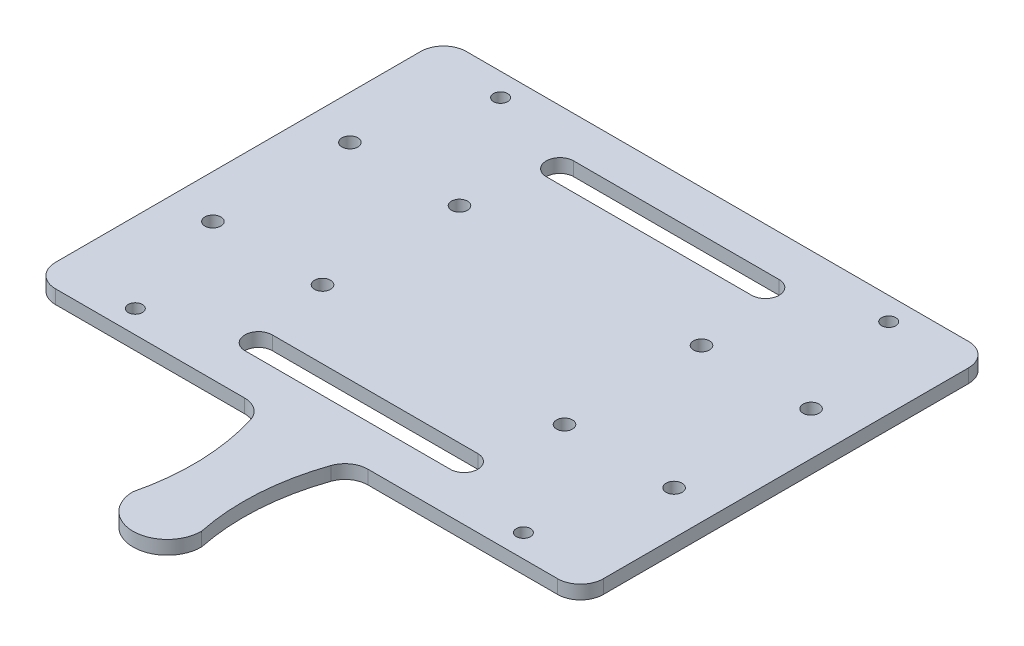
ISO-10303-21;
HEADER;
FILE_DESCRIPTION(('STEP AP214'),'2;1');
FILE_NAME('part.step','',(''),(''),'','','');
FILE_SCHEMA(('AUTOMOTIVE_DESIGN { 1 0 10303 214 1 1 1 1 }'));
ENDSEC;
DATA;
#1=APPLICATION_CONTEXT('core data for automotive mechanical design processes');
#2=APPLICATION_PROTOCOL_DEFINITION('international standard','automotive_design',2000,#1);
#3=PRODUCT_CONTEXT('',#1,'mechanical');
#4=PRODUCT('Part','Part','',(#3));
#5=PRODUCT_RELATED_PRODUCT_CATEGORY('part','',(#4));
#6=PRODUCT_DEFINITION_FORMATION('','',#4);
#7=PRODUCT_DEFINITION_CONTEXT('part definition',#1,'design');
#8=PRODUCT_DEFINITION('design','',#6,#7);
#9=PRODUCT_DEFINITION_SHAPE('','',#8);
#10=(LENGTH_UNIT() NAMED_UNIT(*) SI_UNIT(.MILLI.,.METRE.));
#11=(NAMED_UNIT(*) PLANE_ANGLE_UNIT() SI_UNIT($,.RADIAN.));
#12=(NAMED_UNIT(*) SI_UNIT($,.STERADIAN.) SOLID_ANGLE_UNIT());
#13=UNCERTAINTY_MEASURE_WITH_UNIT(LENGTH_MEASURE(1.E-05),#10,'distance_accuracy_value','');
#14=(GEOMETRIC_REPRESENTATION_CONTEXT(3) GLOBAL_UNCERTAINTY_ASSIGNED_CONTEXT((#13)) GLOBAL_UNIT_ASSIGNED_CONTEXT((#10,
#11,#12)) REPRESENTATION_CONTEXT('',''));
#15=CARTESIAN_POINT('',(0.,0.,0.));
#16=DIRECTION('',(0.,0.,1.));
#17=DIRECTION('',(1.,0.,0.));
#18=AXIS2_PLACEMENT_3D('',#15,#16,#17);
#19=CARTESIAN_POINT('',(60.,3.,45.));
#20=DIRECTION('',(0.,0.,-1.));
#21=DIRECTION('',(-1.,0.,0.));
#22=AXIS2_PLACEMENT_3D('',#19,#20,#21);
#23=PLANE('',#22);
#24=DIRECTION('',(1.,0.,0.));
#25=VECTOR('',#24,1.);
#26=CARTESIAN_POINT('',(60.,3.,45.));
#27=LINE('',#26,#25);
#28=CARTESIAN_POINT('',(13.420612610503,3.,45.));
#29=VERTEX_POINT('',#28);
#30=CARTESIAN_POINT('',(55.,3.,45.));
#31=VERTEX_POINT('',#30);
#32=EDGE_CURVE('E291',#29,#31,#27,.T.);
#33=ORIENTED_EDGE('',*,*,#32,.F.);
#34=DIRECTION('',(0.,1.,0.));
#35=VECTOR('',#34,1.);
#36=CARTESIAN_POINT('',(13.420612610503,3.,45.));
#37=LINE('',#36,#35);
#38=CARTESIAN_POINT('',(13.420612610503,0.,45.));
#39=VERTEX_POINT('',#38);
#40=EDGE_CURVE('E345',#29,#39,#37,.F.);
#41=ORIENTED_EDGE('',*,*,#40,.T.);
#42=DIRECTION('',(1.,0.,0.));
#43=VECTOR('',#42,1.);
#44=CARTESIAN_POINT('',(60.,0.,45.));
#45=LINE('',#44,#43);
#46=CARTESIAN_POINT('',(55.,0.,45.));
#47=VERTEX_POINT('',#46);
#48=EDGE_CURVE('E303',#39,#47,#45,.T.);
#49=ORIENTED_EDGE('',*,*,#48,.T.);
#50=DIRECTION('',(0.,-1.,0.));
#51=VECTOR('',#50,1.);
#52=CARTESIAN_POINT('',(55.,3.,45.));
#53=LINE('',#52,#51);
#54=EDGE_CURVE('E322',#47,#31,#53,.F.);
#55=ORIENTED_EDGE('',*,*,#54,.T.);
#56=EDGE_LOOP('',(#33,#41,#49,#55));
#57=FACE_BOUND('',#56,.T.);
#58=ADVANCED_FACE('F33',(#57),#23,.F.);
#59=CARTESIAN_POINT('',(60.,3.,-45.));
#60=DIRECTION('',(-1.,0.,0.));
#61=DIRECTION('',(0.,0.,1.));
#62=AXIS2_PLACEMENT_3D('',#59,#60,#61);
#63=PLANE('',#62);
#64=DIRECTION('',(0.,0.,-1.));
#65=VECTOR('',#64,1.);
#66=CARTESIAN_POINT('',(60.,3.,-45.));
#67=LINE('',#66,#65);
#68=CARTESIAN_POINT('',(60.,3.,40.));
#69=VERTEX_POINT('',#68);
#70=CARTESIAN_POINT('',(60.,3.,-40.));
#71=VERTEX_POINT('',#70);
#72=EDGE_CURVE('E281',#69,#71,#67,.T.);
#73=ORIENTED_EDGE('',*,*,#72,.F.);
#74=DIRECTION('',(0.,-1.,0.));
#75=VECTOR('',#74,1.);
#76=CARTESIAN_POINT('',(60.,3.,40.));
#77=LINE('',#76,#75);
#78=CARTESIAN_POINT('',(60.,0.,40.));
#79=VERTEX_POINT('',#78);
#80=EDGE_CURVE('E307',#69,#79,#77,.T.);
#81=ORIENTED_EDGE('',*,*,#80,.T.);
#82=DIRECTION('',(0.,0.,-1.));
#83=VECTOR('',#82,1.);
#84=CARTESIAN_POINT('',(60.,0.,-45.));
#85=LINE('',#84,#83);
#86=CARTESIAN_POINT('',(60.,0.,-40.));
#87=VERTEX_POINT('',#86);
#88=EDGE_CURVE('E244',#79,#87,#85,.T.);
#89=ORIENTED_EDGE('',*,*,#88,.T.);
#90=DIRECTION('',(0.,-1.,0.));
#91=VECTOR('',#90,1.);
#92=CARTESIAN_POINT('',(60.,3.,-40.));
#93=LINE('',#92,#91);
#94=EDGE_CURVE('E294',#87,#71,#93,.F.);
#95=ORIENTED_EDGE('',*,*,#94,.T.);
#96=EDGE_LOOP('',(#73,#81,#89,#95));
#97=FACE_BOUND('',#96,.T.);
#98=ADVANCED_FACE('F373',(#97),#63,.F.);
#99=CARTESIAN_POINT('',(60.,3.,-45.));
#100=DIRECTION('',(0.,0.,1.));
#101=DIRECTION('',(1.,0.,0.));
#102=AXIS2_PLACEMENT_3D('',#99,#100,#101);
#103=PLANE('',#102);
#104=DIRECTION('',(-1.,0.,0.));
#105=VECTOR('',#104,1.);
#106=CARTESIAN_POINT('',(60.,3.,-45.));
#107=LINE('',#106,#105);
#108=CARTESIAN_POINT('',(55.,3.,-45.));
#109=VERTEX_POINT('',#108);
#110=CARTESIAN_POINT('',(-55.,3.,-45.));
#111=VERTEX_POINT('',#110);
#112=EDGE_CURVE('E284',#109,#111,#107,.T.);
#113=ORIENTED_EDGE('',*,*,#112,.F.);
#114=DIRECTION('',(0.,-1.,0.));
#115=VECTOR('',#114,1.);
#116=CARTESIAN_POINT('',(55.,3.,-45.));
#117=LINE('',#116,#115);
#118=CARTESIAN_POINT('',(55.,0.,-45.));
#119=VERTEX_POINT('',#118);
#120=EDGE_CURVE('E335',#109,#119,#117,.T.);
#121=ORIENTED_EDGE('',*,*,#120,.T.);
#122=DIRECTION('',(-1.,0.,0.));
#123=VECTOR('',#122,1.);
#124=CARTESIAN_POINT('',(60.,0.,-45.));
#125=LINE('',#124,#123);
#126=CARTESIAN_POINT('',(-55.,0.,-45.));
#127=VERTEX_POINT('',#126);
#128=EDGE_CURVE('E297',#119,#127,#125,.T.);
#129=ORIENTED_EDGE('',*,*,#128,.T.);
#130=DIRECTION('',(0.,-1.,0.));
#131=VECTOR('',#130,1.);
#132=CARTESIAN_POINT('',(-55.,3.,-45.));
#133=LINE('',#132,#131);
#134=EDGE_CURVE('E333',#127,#111,#133,.F.);
#135=ORIENTED_EDGE('',*,*,#134,.T.);
#136=EDGE_LOOP('',(#113,#121,#129,#135));
#137=FACE_BOUND('',#136,.T.);
#138=ADVANCED_FACE('F379',(#137),#103,.F.);
#139=CARTESIAN_POINT('',(-60.,3.,-45.));
#140=DIRECTION('',(1.,0.,0.));
#141=DIRECTION('',(0.,0.,-1.));
#142=AXIS2_PLACEMENT_3D('',#139,#140,#141);
#143=PLANE('',#142);
#144=DIRECTION('',(0.,0.,1.));
#145=VECTOR('',#144,1.);
#146=CARTESIAN_POINT('',(-60.,0.,-45.));
#147=LINE('',#146,#145);
#148=CARTESIAN_POINT('',(-60.,0.,-40.));
#149=VERTEX_POINT('',#148);
#150=CARTESIAN_POINT('',(-60.,0.,40.));
#151=VERTEX_POINT('',#150);
#152=EDGE_CURVE('E300',#149,#151,#147,.T.);
#153=ORIENTED_EDGE('',*,*,#152,.T.);
#154=DIRECTION('',(0.,-1.,0.));
#155=VECTOR('',#154,1.);
#156=CARTESIAN_POINT('',(-60.,3.,40.));
#157=LINE('',#156,#155);
#158=CARTESIAN_POINT('',(-60.,3.,40.));
#159=VERTEX_POINT('',#158);
#160=EDGE_CURVE('E341',#151,#159,#157,.F.);
#161=ORIENTED_EDGE('',*,*,#160,.T.);
#162=DIRECTION('',(0.,0.,1.));
#163=VECTOR('',#162,1.);
#164=CARTESIAN_POINT('',(-60.,3.,-45.));
#165=LINE('',#164,#163);
#166=CARTESIAN_POINT('',(-60.,3.,-40.));
#167=VERTEX_POINT('',#166);
#168=EDGE_CURVE('E288',#167,#159,#165,.T.);
#169=ORIENTED_EDGE('',*,*,#168,.F.);
#170=DIRECTION('',(0.,-1.,0.));
#171=VECTOR('',#170,1.);
#172=CARTESIAN_POINT('',(-60.,3.,-40.));
#173=LINE('',#172,#171);
#174=EDGE_CURVE('E338',#167,#149,#173,.T.);
#175=ORIENTED_EDGE('',*,*,#174,.T.);
#176=EDGE_LOOP('',(#153,#161,#169,#175));
#177=FACE_BOUND('',#176,.T.);
#178=ADVANCED_FACE('F385',(#177),#143,.F.);
#179=CARTESIAN_POINT('',(-55.,0.,45.));
#180=VERTEX_POINT('',#179);
#181=CARTESIAN_POINT('',(-13.5518340227929,0.,45.));
#182=VERTEX_POINT('',#181);
#183=EDGE_CURVE('E285',#180,#182,#45,.T.);
#184=ORIENTED_EDGE('',*,*,#183,.T.);
#185=DIRECTION('',(0.,1.,0.));
#186=VECTOR('',#185,1.);
#187=CARTESIAN_POINT('',(-13.5518340227929,3.,45.));
#188=LINE('',#187,#186);
#189=CARTESIAN_POINT('',(-13.5518340227929,3.,45.));
#190=VERTEX_POINT('',#189);
#191=EDGE_CURVE('E347',#182,#190,#188,.T.);
#192=ORIENTED_EDGE('',*,*,#191,.T.);
#193=CARTESIAN_POINT('',(-55.,3.,45.));
#194=VERTEX_POINT('',#193);
#195=EDGE_CURVE('E292',#194,#190,#27,.T.);
#196=ORIENTED_EDGE('',*,*,#195,.F.);
#197=DIRECTION('',(0.,-1.,0.));
#198=VECTOR('',#197,1.);
#199=CARTESIAN_POINT('',(-55.,3.,45.));
#200=LINE('',#199,#198);
#201=EDGE_CURVE('E319',#194,#180,#200,.T.);
#202=ORIENTED_EDGE('',*,*,#201,.T.);
#203=EDGE_LOOP('',(#184,#192,#196,#202));
#204=FACE_BOUND('',#203,.T.);
#205=ADVANCED_FACE('F375',(#204),#23,.F.);
#206=CARTESIAN_POINT('',(0.,3.,0.));
#207=DIRECTION('',(0.,-1.,0.));
#208=DIRECTION('',(0.,0.,-1.));
#209=AXIS2_PLACEMENT_3D('',#206,#207,#208);
#210=PLANE('',#209);
#211=CARTESIAN_POINT('',(42.5,3.,-40.));
#212=DIRECTION('',(0.,1.,0.));
#213=DIRECTION('',(0.,0.,1.));
#214=AXIS2_PLACEMENT_3D('',#211,#212,#213);
#215=CIRCLE('',#214,1.55);
#216=CARTESIAN_POINT('',(42.5,3.,-38.45));
#217=VERTEX_POINT('',#216);
#218=EDGE_CURVE('E439',#217,#217,#215,.T.);
#219=ORIENTED_EDGE('',*,*,#218,.F.);
#220=EDGE_LOOP('',(#219));
#221=FACE_BOUND('',#220,.T.);
#222=CARTESIAN_POINT('',(-42.5,3.,40.));
#223=DIRECTION('',(0.,1.,0.));
#224=DIRECTION('',(0.,0.,1.));
#225=AXIS2_PLACEMENT_3D('',#222,#223,#224);
#226=CIRCLE('',#225,1.55);
#227=CARTESIAN_POINT('',(-42.5,3.,41.55));
#228=VERTEX_POINT('',#227);
#229=EDGE_CURVE('E432',#228,#228,#226,.T.);
#230=ORIENTED_EDGE('',*,*,#229,.F.);
#231=EDGE_LOOP('',(#230));
#232=FACE_BOUND('',#231,.T.);
#233=CARTESIAN_POINT('',(-42.5,3.,-40.));
#234=DIRECTION('',(0.,1.,0.));
#235=DIRECTION('',(0.,0.,1.));
#236=AXIS2_PLACEMENT_3D('',#233,#234,#235);
#237=CIRCLE('',#236,1.55);
#238=CARTESIAN_POINT('',(-42.5,3.,-38.45));
#239=VERTEX_POINT('',#238);
#240=EDGE_CURVE('E451',#239,#239,#237,.T.);
#241=ORIENTED_EDGE('',*,*,#240,.F.);
#242=EDGE_LOOP('',(#241));
#243=FACE_BOUND('',#242,.T.);
#244=CARTESIAN_POINT('',(50.5,3.,15.));
#245=DIRECTION('',(0.,1.,0.));
#246=DIRECTION('',(0.,0.,1.));
#247=AXIS2_PLACEMENT_3D('',#244,#245,#246);
#248=CIRCLE('',#247,1.75);
#249=CARTESIAN_POINT('',(50.5,3.,16.75));
#250=VERTEX_POINT('',#249);
#251=EDGE_CURVE('E444',#250,#250,#248,.T.);
#252=ORIENTED_EDGE('',*,*,#251,.F.);
#253=EDGE_LOOP('',(#252));
#254=FACE_BOUND('',#253,.T.);
#255=CARTESIAN_POINT('',(-26.5,3.,15.));
#256=DIRECTION('',(0.,1.,0.));
#257=DIRECTION('',(0.,0.,1.));
#258=AXIS2_PLACEMENT_3D('',#255,#256,#257);
#259=CIRCLE('',#258,1.75);
#260=CARTESIAN_POINT('',(-26.5,3.,16.75));
#261=VERTEX_POINT('',#260);
#262=EDGE_CURVE('E415',#261,#261,#259,.T.);
#263=ORIENTED_EDGE('',*,*,#262,.F.);
#264=EDGE_LOOP('',(#263));
#265=FACE_BOUND('',#264,.T.);
#266=CARTESIAN_POINT('',(-26.5,3.,-15.));
#267=DIRECTION('',(0.,1.,0.));
#268=DIRECTION('',(0.,0.,1.));
#269=AXIS2_PLACEMENT_3D('',#266,#267,#268);
#270=CIRCLE('',#269,1.75);
#271=CARTESIAN_POINT('',(-26.5,3.,-13.25));
#272=VERTEX_POINT('',#271);
#273=EDGE_CURVE('E408',#272,#272,#270,.T.);
#274=ORIENTED_EDGE('',*,*,#273,.F.);
#275=EDGE_LOOP('',(#274));
#276=FACE_BOUND('',#275,.T.);
#277=CARTESIAN_POINT('',(-50.5,3.,-15.));
#278=DIRECTION('',(0.,1.,0.));
#279=DIRECTION('',(0.,0.,1.));
#280=AXIS2_PLACEMENT_3D('',#277,#278,#279);
#281=CIRCLE('',#280,1.75);
#282=CARTESIAN_POINT('',(-50.5,3.,-13.25));
#283=VERTEX_POINT('',#282);
#284=EDGE_CURVE('E427',#283,#283,#281,.T.);
#285=ORIENTED_EDGE('',*,*,#284,.F.);
#286=EDGE_LOOP('',(#285));
#287=FACE_BOUND('',#286,.T.);
#288=CARTESIAN_POINT('',(42.5,3.,40.));
#289=DIRECTION('',(0.,1.,0.));
#290=DIRECTION('',(0.,0.,1.));
#291=AXIS2_PLACEMENT_3D('',#288,#289,#290);
#292=CIRCLE('',#291,1.55);
#293=CARTESIAN_POINT('',(42.5,3.,41.55));
#294=VERTEX_POINT('',#293);
#295=EDGE_CURVE('E420',#294,#294,#292,.T.);
#296=ORIENTED_EDGE('',*,*,#295,.F.);
#297=EDGE_LOOP('',(#296));
#298=FACE_BOUND('',#297,.T.);
#299=CARTESIAN_POINT('',(26.5,3.,-15.));
#300=DIRECTION('',(0.,1.,0.));
#301=DIRECTION('',(0.,0.,1.));
#302=AXIS2_PLACEMENT_3D('',#299,#300,#301);
#303=CIRCLE('',#302,1.75);
#304=CARTESIAN_POINT('',(26.5,3.,-13.25));
#305=VERTEX_POINT('',#304);
#306=EDGE_CURVE('E468',#305,#305,#303,.T.);
#307=ORIENTED_EDGE('',*,*,#306,.F.);
#308=EDGE_LOOP('',(#307));
#309=FACE_BOUND('',#308,.T.);
#310=CARTESIAN_POINT('',(26.5,3.,15.));
#311=DIRECTION('',(0.,1.,0.));
#312=DIRECTION('',(0.,0.,1.));
#313=AXIS2_PLACEMENT_3D('',#310,#311,#312);
#314=CIRCLE('',#313,1.75);
#315=CARTESIAN_POINT('',(26.5,3.,16.75));
#316=VERTEX_POINT('',#315);
#317=EDGE_CURVE('E456',#316,#316,#314,.T.);
#318=ORIENTED_EDGE('',*,*,#317,.F.);
#319=EDGE_LOOP('',(#318));
#320=FACE_BOUND('',#319,.T.);
#321=CARTESIAN_POINT('',(50.5,3.,-15.));
#322=DIRECTION('',(0.,1.,0.));
#323=DIRECTION('',(0.,0.,1.));
#324=AXIS2_PLACEMENT_3D('',#321,#322,#323);
#325=CIRCLE('',#324,1.75);
#326=CARTESIAN_POINT('',(50.5,3.,-13.25));
#327=VERTEX_POINT('',#326);
#328=EDGE_CURVE('E463',#327,#327,#325,.T.);
#329=ORIENTED_EDGE('',*,*,#328,.F.);
#330=EDGE_LOOP('',(#329));
#331=FACE_BOUND('',#330,.T.);
#332=CARTESIAN_POINT('',(-50.5,3.,15.));
#333=DIRECTION('',(0.,1.,0.));
#334=DIRECTION('',(0.,0.,1.));
#335=AXIS2_PLACEMENT_3D('',#332,#333,#334);
#336=CIRCLE('',#335,1.75);
#337=CARTESIAN_POINT('',(-50.5,3.,16.75));
#338=VERTEX_POINT('',#337);
#339=EDGE_CURVE('E402',#338,#338,#336,.T.);
#340=ORIENTED_EDGE('',*,*,#339,.F.);
#341=EDGE_LOOP('',(#340));
#342=FACE_BOUND('',#341,.T.);
#343=DIRECTION('',(1.,0.,0.));
#344=VECTOR('',#343,1.);
#345=CARTESIAN_POINT('',(-22.5,3.,-30.));
#346=LINE('',#345,#344);
#347=CARTESIAN_POINT('',(-22.5,3.,-30.));
#348=VERTEX_POINT('',#347);
#349=CARTESIAN_POINT('',(22.5,3.,-30.));
#350=VERTEX_POINT('',#349);
#351=EDGE_CURVE('E233',#348,#350,#346,.T.);
#352=ORIENTED_EDGE('',*,*,#351,.F.);
#353=CARTESIAN_POINT('',(-22.5,3.,-33.));
#354=DIRECTION('',(0.,1.,0.));
#355=DIRECTION('',(0.,0.,1.));
#356=AXIS2_PLACEMENT_3D('',#353,#354,#355);
#357=CIRCLE('',#356,3.);
#358=CARTESIAN_POINT('',(-22.5,3.,-36.));
#359=VERTEX_POINT('',#358);
#360=EDGE_CURVE('E231',#359,#348,#357,.T.);
#361=ORIENTED_EDGE('',*,*,#360,.F.);
#362=DIRECTION('',(-1.,0.,0.));
#363=VECTOR('',#362,1.);
#364=CARTESIAN_POINT('',(-22.5,3.,-36.));
#365=LINE('',#364,#363);
#366=CARTESIAN_POINT('',(22.5,3.,-36.));
#367=VERTEX_POINT('',#366);
#368=EDGE_CURVE('E221',#367,#359,#365,.T.);
#369=ORIENTED_EDGE('',*,*,#368,.F.);
#370=CARTESIAN_POINT('',(22.5,3.,-33.));
#371=DIRECTION('',(0.,1.,0.));
#372=DIRECTION('',(0.,0.,1.));
#373=AXIS2_PLACEMENT_3D('',#370,#371,#372);
#374=CIRCLE('',#373,3.);
#375=EDGE_CURVE('E237',#350,#367,#374,.T.);
#376=ORIENTED_EDGE('',*,*,#375,.F.);
#377=EDGE_LOOP('',(#352,#361,#369,#376));
#378=FACE_BOUND('',#377,.T.);
#379=DIRECTION('',(1.,0.,0.));
#380=VECTOR('',#379,1.);
#381=CARTESIAN_POINT('',(-22.5,3.,36.));
#382=LINE('',#381,#380);
#383=CARTESIAN_POINT('',(-22.5,3.,36.));
#384=VERTEX_POINT('',#383);
#385=CARTESIAN_POINT('',(22.5,3.,36.));
#386=VERTEX_POINT('',#385);
#387=EDGE_CURVE('E266',#384,#386,#382,.T.);
#388=ORIENTED_EDGE('',*,*,#387,.F.);
#389=CARTESIAN_POINT('',(-22.5,3.,33.));
#390=DIRECTION('',(0.,1.,0.));
#391=DIRECTION('',(0.,0.,1.));
#392=AXIS2_PLACEMENT_3D('',#389,#390,#391);
#393=CIRCLE('',#392,3.);
#394=CARTESIAN_POINT('',(-22.5,3.,30.));
#395=VERTEX_POINT('',#394);
#396=EDGE_CURVE('E216',#395,#384,#393,.T.);
#397=ORIENTED_EDGE('',*,*,#396,.F.);
#398=DIRECTION('',(-1.,0.,0.));
#399=VECTOR('',#398,1.);
#400=CARTESIAN_POINT('',(-22.5,3.,30.));
#401=LINE('',#400,#399);
#402=CARTESIAN_POINT('',(22.5,3.,30.));
#403=VERTEX_POINT('',#402);
#404=EDGE_CURVE('E255',#403,#395,#401,.T.);
#405=ORIENTED_EDGE('',*,*,#404,.F.);
#406=CARTESIAN_POINT('',(22.5,3.,33.));
#407=DIRECTION('',(0.,1.,0.));
#408=DIRECTION('',(0.,0.,1.));
#409=AXIS2_PLACEMENT_3D('',#406,#407,#408);
#410=CIRCLE('',#409,3.);
#411=EDGE_CURVE('E269',#386,#403,#410,.T.);
#412=ORIENTED_EDGE('',*,*,#411,.F.);
#413=EDGE_LOOP('',(#388,#397,#405,#412));
#414=FACE_BOUND('',#413,.T.);
#415=ORIENTED_EDGE('',*,*,#195,.T.);
#416=CARTESIAN_POINT('',(-13.5518340227929,3.,50.));
#417=DIRECTION('',(0.,-1.,0.));
#418=DIRECTION('',(0.,0.,-1.));
#419=AXIS2_PLACEMENT_3D('',#416,#417,#418);
#420=CIRCLE('',#419,5.);
#421=CARTESIAN_POINT('',(-8.77083135272599,3.,48.5364380884934));
#422=VERTEX_POINT('',#421);
#423=EDGE_CURVE('E41',#190,#422,#420,.T.);
#424=ORIENTED_EDGE('',*,*,#423,.T.);
#425=CARTESIAN_POINT('',(-56.5808580533952,3.,63.1720572035597));
#426=DIRECTION('',(0.,-1.,0.));
#427=DIRECTION('',(0.,0.,-1.));
#428=AXIS2_PLACEMENT_3D('',#425,#426,#427);
#429=CIRCLE('',#428,50.);
#430=CARTESIAN_POINT('',(-8.00000000000001,3.,75.));
#431=VERTEX_POINT('',#430);
#432=EDGE_CURVE('E212',#422,#431,#429,.T.);
#433=ORIENTED_EDGE('',*,*,#432,.T.);
#434=CARTESIAN_POINT('',(-0.500000000000007,3.,75.));
#435=DIRECTION('',(0.,1.,0.));
#436=DIRECTION('',(0.,0.,1.));
#437=AXIS2_PLACEMENT_3D('',#434,#435,#436);
#438=CIRCLE('',#437,7.5);
#439=CARTESIAN_POINT('',(7.,3.,75.));
#440=VERTEX_POINT('',#439);
#441=EDGE_CURVE('E208',#431,#440,#438,.T.);
#442=ORIENTED_EDGE('',*,*,#441,.T.);
#443=CARTESIAN_POINT('',(55.9367739707547,3.,64.7436773970755));
#444=DIRECTION('',(0.,-1.,0.));
#445=DIRECTION('',(0.,0.,1.));
#446=AXIS2_PLACEMENT_3D('',#443,#444,#445);
#447=CIRCLE('',#446,50.);
#448=CARTESIAN_POINT('',(8.69659468158611,3.,48.3618136225472));
#449=VERTEX_POINT('',#448);
#450=EDGE_CURVE('E199',#440,#449,#447,.T.);
#451=ORIENTED_EDGE('',*,*,#450,.T.);
#452=CARTESIAN_POINT('',(13.420612610503,3.,50.));
#453=DIRECTION('',(0.,-1.,0.));
#454=DIRECTION('',(0.,0.,-1.));
#455=AXIS2_PLACEMENT_3D('',#452,#453,#454);
#456=CIRCLE('',#455,5.);
#457=EDGE_CURVE('E351',#449,#29,#456,.T.);
#458=ORIENTED_EDGE('',*,*,#457,.T.);
#459=ORIENTED_EDGE('',*,*,#32,.T.);
#460=CARTESIAN_POINT('',(55.,3.,40.));
#461=DIRECTION('',(0.,-1.,0.));
#462=DIRECTION('',(0.,0.,-1.));
#463=AXIS2_PLACEMENT_3D('',#460,#461,#462);
#464=CIRCLE('',#463,5.);
#465=EDGE_CURVE('E331',#31,#69,#464,.F.);
#466=ORIENTED_EDGE('',*,*,#465,.T.);
#467=ORIENTED_EDGE('',*,*,#72,.T.);
#468=CARTESIAN_POINT('',(55.,3.,-40.));
#469=DIRECTION('',(0.,-1.,0.));
#470=DIRECTION('',(0.,0.,-1.));
#471=AXIS2_PLACEMENT_3D('',#468,#469,#470);
#472=CIRCLE('',#471,5.);
#473=EDGE_CURVE('E329',#71,#109,#472,.F.);
#474=ORIENTED_EDGE('',*,*,#473,.T.);
#475=ORIENTED_EDGE('',*,*,#112,.T.);
#476=CARTESIAN_POINT('',(-55.,3.,-40.));
#477=DIRECTION('',(0.,-1.,0.));
#478=DIRECTION('',(0.,0.,-1.));
#479=AXIS2_PLACEMENT_3D('',#476,#477,#478);
#480=CIRCLE('',#479,5.);
#481=EDGE_CURVE('E325',#111,#167,#480,.F.);
#482=ORIENTED_EDGE('',*,*,#481,.T.);
#483=ORIENTED_EDGE('',*,*,#168,.T.);
#484=CARTESIAN_POINT('',(-55.,3.,40.));
#485=DIRECTION('',(0.,-1.,0.));
#486=DIRECTION('',(0.,0.,-1.));
#487=AXIS2_PLACEMENT_3D('',#484,#485,#486);
#488=CIRCLE('',#487,5.);
#489=EDGE_CURVE('E327',#159,#194,#488,.F.);
#490=ORIENTED_EDGE('',*,*,#489,.T.);
#491=EDGE_LOOP('',(#415,#424,#433,#442,#451,#458,#459,#466,#467,#474,#475,#482,#483,#490));
#492=FACE_BOUND('',#491,.T.);
#493=ADVANCED_FACE('F354',(#221,#232,#243,#254,#265,#276,#287,#298,#309,#320,#331,#342,#378,
#414,#492),#210,.F.);
#494=CARTESIAN_POINT('',(0.,0.,0.));
#495=DIRECTION('',(0.,-1.,0.));
#496=DIRECTION('',(0.,0.,-1.));
#497=AXIS2_PLACEMENT_3D('',#494,#495,#496);
#498=PLANE('',#497);
#499=CARTESIAN_POINT('',(42.5,0.,-40.));
#500=DIRECTION('',(0.,1.,0.));
#501=DIRECTION('',(0.,0.,1.));
#502=AXIS2_PLACEMENT_3D('',#499,#500,#501);
#503=CIRCLE('',#502,1.55);
#504=CARTESIAN_POINT('',(42.5,0.,-38.45));
#505=VERTEX_POINT('',#504);
#506=EDGE_CURVE('E424',#505,#505,#503,.T.);
#507=ORIENTED_EDGE('',*,*,#506,.T.);
#508=EDGE_LOOP('',(#507));
#509=FACE_BOUND('',#508,.T.);
#510=CARTESIAN_POINT('',(-42.5,0.,40.));
#511=DIRECTION('',(0.,1.,0.));
#512=DIRECTION('',(0.,0.,1.));
#513=AXIS2_PLACEMENT_3D('',#510,#511,#512);
#514=CIRCLE('',#513,1.55);
#515=CARTESIAN_POINT('',(-42.5,0.,41.55));
#516=VERTEX_POINT('',#515);
#517=EDGE_CURVE('E435',#516,#516,#514,.T.);
#518=ORIENTED_EDGE('',*,*,#517,.T.);
#519=EDGE_LOOP('',(#518));
#520=FACE_BOUND('',#519,.T.);
#521=CARTESIAN_POINT('',(-42.5,0.,-40.));
#522=DIRECTION('',(0.,1.,0.));
#523=DIRECTION('',(0.,0.,1.));
#524=AXIS2_PLACEMENT_3D('',#521,#522,#523);
#525=CIRCLE('',#524,1.55);
#526=CARTESIAN_POINT('',(-42.5,0.,-38.45));
#527=VERTEX_POINT('',#526);
#528=EDGE_CURVE('E436',#527,#527,#525,.T.);
#529=ORIENTED_EDGE('',*,*,#528,.T.);
#530=EDGE_LOOP('',(#529));
#531=FACE_BOUND('',#530,.T.);
#532=CARTESIAN_POINT('',(50.5,0.,15.));
#533=DIRECTION('',(0.,1.,0.));
#534=DIRECTION('',(0.,0.,1.));
#535=AXIS2_PLACEMENT_3D('',#532,#533,#534);
#536=CIRCLE('',#535,1.75);
#537=CARTESIAN_POINT('',(50.5,0.,16.75));
#538=VERTEX_POINT('',#537);
#539=EDGE_CURVE('E447',#538,#538,#536,.T.);
#540=ORIENTED_EDGE('',*,*,#539,.T.);
#541=EDGE_LOOP('',(#540));
#542=FACE_BOUND('',#541,.T.);
#543=CARTESIAN_POINT('',(-26.5,0.,15.));
#544=DIRECTION('',(0.,1.,0.));
#545=DIRECTION('',(0.,0.,1.));
#546=AXIS2_PLACEMENT_3D('',#543,#544,#545);
#547=CIRCLE('',#546,1.75);
#548=CARTESIAN_POINT('',(-26.5,0.,16.75));
#549=VERTEX_POINT('',#548);
#550=EDGE_CURVE('E405',#549,#549,#547,.T.);
#551=ORIENTED_EDGE('',*,*,#550,.T.);
#552=EDGE_LOOP('',(#551));
#553=FACE_BOUND('',#552,.T.);
#554=CARTESIAN_POINT('',(-26.5,0.,-15.));
#555=DIRECTION('',(0.,1.,0.));
#556=DIRECTION('',(0.,0.,1.));
#557=AXIS2_PLACEMENT_3D('',#554,#555,#556);
#558=CIRCLE('',#557,1.75);
#559=CARTESIAN_POINT('',(-26.5,0.,-13.25));
#560=VERTEX_POINT('',#559);
#561=EDGE_CURVE('E411',#560,#560,#558,.T.);
#562=ORIENTED_EDGE('',*,*,#561,.T.);
#563=EDGE_LOOP('',(#562));
#564=FACE_BOUND('',#563,.T.);
#565=CARTESIAN_POINT('',(-50.5,0.,-15.));
#566=DIRECTION('',(0.,1.,0.));
#567=DIRECTION('',(0.,0.,1.));
#568=AXIS2_PLACEMENT_3D('',#565,#566,#567);
#569=CIRCLE('',#568,1.75);
#570=CARTESIAN_POINT('',(-50.5,0.,-13.25));
#571=VERTEX_POINT('',#570);
#572=EDGE_CURVE('E412',#571,#571,#569,.T.);
#573=ORIENTED_EDGE('',*,*,#572,.T.);
#574=EDGE_LOOP('',(#573));
#575=FACE_BOUND('',#574,.T.);
#576=CARTESIAN_POINT('',(42.5,0.,40.));
#577=DIRECTION('',(0.,1.,0.));
#578=DIRECTION('',(0.,0.,1.));
#579=AXIS2_PLACEMENT_3D('',#576,#577,#578);
#580=CIRCLE('',#579,1.55);
#581=CARTESIAN_POINT('',(42.5,0.,41.55));
#582=VERTEX_POINT('',#581);
#583=EDGE_CURVE('E423',#582,#582,#580,.T.);
#584=ORIENTED_EDGE('',*,*,#583,.T.);
#585=EDGE_LOOP('',(#584));
#586=FACE_BOUND('',#585,.T.);
#587=CARTESIAN_POINT('',(26.5,0.,-15.));
#588=DIRECTION('',(0.,1.,0.));
#589=DIRECTION('',(0.,0.,1.));
#590=AXIS2_PLACEMENT_3D('',#587,#588,#589);
#591=CIRCLE('',#590,1.75);
#592=CARTESIAN_POINT('',(26.5,0.,-13.25));
#593=VERTEX_POINT('',#592);
#594=EDGE_CURVE('E460',#593,#593,#591,.T.);
#595=ORIENTED_EDGE('',*,*,#594,.T.);
#596=EDGE_LOOP('',(#595));
#597=FACE_BOUND('',#596,.T.);
#598=CARTESIAN_POINT('',(26.5,0.,15.));
#599=DIRECTION('',(0.,1.,0.));
#600=DIRECTION('',(0.,0.,1.));
#601=AXIS2_PLACEMENT_3D('',#598,#599,#600);
#602=CIRCLE('',#601,1.75);
#603=CARTESIAN_POINT('',(26.5,0.,16.75));
#604=VERTEX_POINT('',#603);
#605=EDGE_CURVE('E459',#604,#604,#602,.T.);
#606=ORIENTED_EDGE('',*,*,#605,.T.);
#607=EDGE_LOOP('',(#606));
#608=FACE_BOUND('',#607,.T.);
#609=CARTESIAN_POINT('',(50.5,0.,-15.));
#610=DIRECTION('',(0.,1.,0.));
#611=DIRECTION('',(0.,0.,1.));
#612=AXIS2_PLACEMENT_3D('',#609,#610,#611);
#613=CIRCLE('',#612,1.75);
#614=CARTESIAN_POINT('',(50.5,0.,-13.25));
#615=VERTEX_POINT('',#614);
#616=EDGE_CURVE('E448',#615,#615,#613,.T.);
#617=ORIENTED_EDGE('',*,*,#616,.T.);
#618=EDGE_LOOP('',(#617));
#619=FACE_BOUND('',#618,.T.);
#620=CARTESIAN_POINT('',(-50.5,0.,15.));
#621=DIRECTION('',(0.,1.,0.));
#622=DIRECTION('',(0.,0.,1.));
#623=AXIS2_PLACEMENT_3D('',#620,#621,#622);
#624=CIRCLE('',#623,1.75);
#625=CARTESIAN_POINT('',(-50.5,0.,16.75));
#626=VERTEX_POINT('',#625);
#627=EDGE_CURVE('E400',#626,#626,#624,.T.);
#628=ORIENTED_EDGE('',*,*,#627,.T.);
#629=EDGE_LOOP('',(#628));
#630=FACE_BOUND('',#629,.T.);
#631=CARTESIAN_POINT('',(-22.5,0.,-33.));
#632=DIRECTION('',(0.,1.,0.));
#633=DIRECTION('',(0.,0.,1.));
#634=AXIS2_PLACEMENT_3D('',#631,#632,#633);
#635=CIRCLE('',#634,3.);
#636=CARTESIAN_POINT('',(-22.5,0.,-36.));
#637=VERTEX_POINT('',#636);
#638=CARTESIAN_POINT('',(-22.5,0.,-30.));
#639=VERTEX_POINT('',#638);
#640=EDGE_CURVE('E217',#637,#639,#635,.T.);
#641=ORIENTED_EDGE('',*,*,#640,.T.);
#642=DIRECTION('',(1.,0.,0.));
#643=VECTOR('',#642,1.);
#644=CARTESIAN_POINT('',(-22.5,0.,-30.));
#645=LINE('',#644,#643);
#646=CARTESIAN_POINT('',(22.5,0.,-30.));
#647=VERTEX_POINT('',#646);
#648=EDGE_CURVE('E220',#639,#647,#645,.T.);
#649=ORIENTED_EDGE('',*,*,#648,.T.);
#650=CARTESIAN_POINT('',(22.5,0.,-33.));
#651=DIRECTION('',(0.,1.,0.));
#652=DIRECTION('',(0.,0.,1.));
#653=AXIS2_PLACEMENT_3D('',#650,#651,#652);
#654=CIRCLE('',#653,3.);
#655=CARTESIAN_POINT('',(22.5,0.,-36.));
#656=VERTEX_POINT('',#655);
#657=EDGE_CURVE('E224',#647,#656,#654,.T.);
#658=ORIENTED_EDGE('',*,*,#657,.T.);
#659=DIRECTION('',(-1.,0.,0.));
#660=VECTOR('',#659,1.);
#661=CARTESIAN_POINT('',(-22.5,0.,-36.));
#662=LINE('',#661,#660);
#663=EDGE_CURVE('E227',#656,#637,#662,.T.);
#664=ORIENTED_EDGE('',*,*,#663,.T.);
#665=EDGE_LOOP('',(#641,#649,#658,#664));
#666=FACE_BOUND('',#665,.T.);
#667=CARTESIAN_POINT('',(-22.5,0.,33.));
#668=DIRECTION('',(0.,1.,0.));
#669=DIRECTION('',(0.,0.,1.));
#670=AXIS2_PLACEMENT_3D('',#667,#668,#669);
#671=CIRCLE('',#670,3.);
#672=CARTESIAN_POINT('',(-22.5,0.,30.));
#673=VERTEX_POINT('',#672);
#674=CARTESIAN_POINT('',(-22.5,0.,36.));
#675=VERTEX_POINT('',#674);
#676=EDGE_CURVE('E251',#673,#675,#671,.T.);
#677=ORIENTED_EDGE('',*,*,#676,.T.);
#678=DIRECTION('',(1.,0.,0.));
#679=VECTOR('',#678,1.);
#680=CARTESIAN_POINT('',(-22.5,0.,36.));
#681=LINE('',#680,#679);
#682=CARTESIAN_POINT('',(22.5,0.,36.));
#683=VERTEX_POINT('',#682);
#684=EDGE_CURVE('E254',#675,#683,#681,.T.);
#685=ORIENTED_EDGE('',*,*,#684,.T.);
#686=CARTESIAN_POINT('',(22.5,0.,33.));
#687=DIRECTION('',(0.,1.,0.));
#688=DIRECTION('',(0.,0.,1.));
#689=AXIS2_PLACEMENT_3D('',#686,#687,#688);
#690=CIRCLE('',#689,3.);
#691=CARTESIAN_POINT('',(22.5,0.,30.));
#692=VERTEX_POINT('',#691);
#693=EDGE_CURVE('E258',#683,#692,#690,.T.);
#694=ORIENTED_EDGE('',*,*,#693,.T.);
#695=DIRECTION('',(-1.,0.,0.));
#696=VECTOR('',#695,1.);
#697=CARTESIAN_POINT('',(-22.5,0.,30.));
#698=LINE('',#697,#696);
#699=EDGE_CURVE('E261',#692,#673,#698,.T.);
#700=ORIENTED_EDGE('',*,*,#699,.T.);
#701=EDGE_LOOP('',(#677,#685,#694,#700));
#702=FACE_BOUND('',#701,.T.);
#703=ORIENTED_EDGE('',*,*,#88,.F.);
#704=CARTESIAN_POINT('',(55.,0.,40.));
#705=DIRECTION('',(0.,-1.,0.));
#706=DIRECTION('',(0.,0.,-1.));
#707=AXIS2_PLACEMENT_3D('',#704,#705,#706);
#708=CIRCLE('',#707,5.);
#709=EDGE_CURVE('E316',#79,#47,#708,.T.);
#710=ORIENTED_EDGE('',*,*,#709,.T.);
#711=ORIENTED_EDGE('',*,*,#48,.F.);
#712=CARTESIAN_POINT('',(13.420612610503,0.,50.));
#713=DIRECTION('',(0.,-1.,0.));
#714=DIRECTION('',(0.,0.,-1.));
#715=AXIS2_PLACEMENT_3D('',#712,#713,#714);
#716=CIRCLE('',#715,5.);
#717=CARTESIAN_POINT('',(8.69659468158611,0.,48.3618136225472));
#718=VERTEX_POINT('',#717);
#719=EDGE_CURVE('E189',#39,#718,#716,.F.);
#720=ORIENTED_EDGE('',*,*,#719,.T.);
#721=CARTESIAN_POINT('',(55.9367739707547,0.,64.7436773970755));
#722=DIRECTION('',(0.,-1.,0.));
#723=DIRECTION('',(0.,0.,-1.));
#724=AXIS2_PLACEMENT_3D('',#721,#722,#723);
#725=CIRCLE('',#724,50.);
#726=CARTESIAN_POINT('',(7.,0.,75.));
#727=VERTEX_POINT('',#726);
#728=EDGE_CURVE('E180',#727,#718,#725,.T.);
#729=ORIENTED_EDGE('',*,*,#728,.F.);
#730=CARTESIAN_POINT('',(-0.500000000000007,0.,75.));
#731=DIRECTION('',(0.,-1.,0.));
#732=DIRECTION('',(0.,0.,-1.));
#733=AXIS2_PLACEMENT_3D('',#730,#731,#732);
#734=CIRCLE('',#733,7.5);
#735=CARTESIAN_POINT('',(-8.00000000000001,0.,75.));
#736=VERTEX_POINT('',#735);
#737=EDGE_CURVE('E185',#736,#727,#734,.F.);
#738=ORIENTED_EDGE('',*,*,#737,.F.);
#739=CARTESIAN_POINT('',(-56.5808580533952,0.,63.1720572035597));
#740=DIRECTION('',(0.,-1.,0.));
#741=DIRECTION('',(0.,0.,-1.));
#742=AXIS2_PLACEMENT_3D('',#739,#740,#741);
#743=CIRCLE('',#742,50.);
#744=CARTESIAN_POINT('',(-8.77083135272599,0.,48.5364380884934));
#745=VERTEX_POINT('',#744);
#746=EDGE_CURVE('E193',#745,#736,#743,.T.);
#747=ORIENTED_EDGE('',*,*,#746,.F.);
#748=CARTESIAN_POINT('',(-13.5518340227929,0.,50.));
#749=DIRECTION('',(0.,-1.,0.));
#750=DIRECTION('',(0.,0.,-1.));
#751=AXIS2_PLACEMENT_3D('',#748,#749,#750);
#752=CIRCLE('',#751,5.);
#753=EDGE_CURVE('E11',#745,#182,#752,.F.);
#754=ORIENTED_EDGE('',*,*,#753,.T.);
#755=ORIENTED_EDGE('',*,*,#183,.F.);
#756=CARTESIAN_POINT('',(-55.,0.,40.));
#757=DIRECTION('',(0.,-1.,0.));
#758=DIRECTION('',(0.,0.,-1.));
#759=AXIS2_PLACEMENT_3D('',#756,#757,#758);
#760=CIRCLE('',#759,5.);
#761=EDGE_CURVE('E312',#180,#151,#760,.T.);
#762=ORIENTED_EDGE('',*,*,#761,.T.);
#763=ORIENTED_EDGE('',*,*,#152,.F.);
#764=CARTESIAN_POINT('',(-55.,0.,-40.));
#765=DIRECTION('',(0.,-1.,0.));
#766=DIRECTION('',(0.,0.,-1.));
#767=AXIS2_PLACEMENT_3D('',#764,#765,#766);
#768=CIRCLE('',#767,5.);
#769=EDGE_CURVE('E310',#149,#127,#768,.T.);
#770=ORIENTED_EDGE('',*,*,#769,.T.);
#771=ORIENTED_EDGE('',*,*,#128,.F.);
#772=CARTESIAN_POINT('',(55.,0.,-40.));
#773=DIRECTION('',(0.,-1.,0.));
#774=DIRECTION('',(0.,0.,-1.));
#775=AXIS2_PLACEMENT_3D('',#772,#773,#774);
#776=CIRCLE('',#775,5.);
#777=EDGE_CURVE('E314',#119,#87,#776,.T.);
#778=ORIENTED_EDGE('',*,*,#777,.T.);
#779=EDGE_LOOP('',(#703,#710,#711,#720,#729,#738,#747,#754,#755,#762,#763,#770,#771,#778));
#780=FACE_BOUND('',#779,.T.);
#781=ADVANCED_FACE('F183',(#509,#520,#531,#542,#553,#564,#575,#586,#597,#608,#619,#630,#666,
#702,#780),#498,.T.);
#782=CARTESIAN_POINT('',(55.,3.,40.));
#783=DIRECTION('',(0.,-1.,0.));
#784=DIRECTION('',(0.,0.,-1.));
#785=AXIS2_PLACEMENT_3D('',#782,#783,#784);
#786=CYLINDRICAL_SURFACE('',#785,5.);
#787=ORIENTED_EDGE('',*,*,#465,.F.);
#788=ORIENTED_EDGE('',*,*,#54,.F.);
#789=ORIENTED_EDGE('',*,*,#709,.F.);
#790=ORIENTED_EDGE('',*,*,#80,.F.);
#791=EDGE_LOOP('',(#787,#788,#789,#790));
#792=FACE_BOUND('',#791,.T.);
#793=ADVANCED_FACE('F513',(#792),#786,.T.);
#794=CARTESIAN_POINT('',(55.,3.,-40.));
#795=DIRECTION('',(0.,-1.,0.));
#796=DIRECTION('',(0.,0.,-1.));
#797=AXIS2_PLACEMENT_3D('',#794,#795,#796);
#798=CYLINDRICAL_SURFACE('',#797,5.);
#799=ORIENTED_EDGE('',*,*,#473,.F.);
#800=ORIENTED_EDGE('',*,*,#94,.F.);
#801=ORIENTED_EDGE('',*,*,#777,.F.);
#802=ORIENTED_EDGE('',*,*,#120,.F.);
#803=EDGE_LOOP('',(#799,#800,#801,#802));
#804=FACE_BOUND('',#803,.T.);
#805=ADVANCED_FACE('F518',(#804),#798,.T.);
#806=CARTESIAN_POINT('',(-55.,3.,40.));
#807=DIRECTION('',(0.,-1.,0.));
#808=DIRECTION('',(0.,0.,-1.));
#809=AXIS2_PLACEMENT_3D('',#806,#807,#808);
#810=CYLINDRICAL_SURFACE('',#809,5.);
#811=ORIENTED_EDGE('',*,*,#489,.F.);
#812=ORIENTED_EDGE('',*,*,#160,.F.);
#813=ORIENTED_EDGE('',*,*,#761,.F.);
#814=ORIENTED_EDGE('',*,*,#201,.F.);
#815=EDGE_LOOP('',(#811,#812,#813,#814));
#816=FACE_BOUND('',#815,.T.);
#817=ADVANCED_FACE('F776',(#816),#810,.T.);
#818=CARTESIAN_POINT('',(-55.,3.,-40.));
#819=DIRECTION('',(0.,-1.,0.));
#820=DIRECTION('',(0.,0.,-1.));
#821=AXIS2_PLACEMENT_3D('',#818,#819,#820);
#822=CYLINDRICAL_SURFACE('',#821,5.);
#823=ORIENTED_EDGE('',*,*,#481,.F.);
#824=ORIENTED_EDGE('',*,*,#134,.F.);
#825=ORIENTED_EDGE('',*,*,#769,.F.);
#826=ORIENTED_EDGE('',*,*,#174,.F.);
#827=EDGE_LOOP('',(#823,#824,#825,#826));
#828=FACE_BOUND('',#827,.T.);
#829=ADVANCED_FACE('F525',(#828),#822,.T.);
#830=CARTESIAN_POINT('',(-22.5,0.,33.));
#831=DIRECTION('',(0.,1.,0.));
#832=DIRECTION('',(0.,0.,1.));
#833=AXIS2_PLACEMENT_3D('',#830,#831,#832);
#834=CYLINDRICAL_SURFACE('',#833,3.);
#835=ORIENTED_EDGE('',*,*,#396,.T.);
#836=DIRECTION('',(0.,1.,0.));
#837=VECTOR('',#836,1.);
#838=CARTESIAN_POINT('',(-22.5,0.,36.));
#839=LINE('',#838,#837);
#840=EDGE_CURVE('E264',#675,#384,#839,.T.);
#841=ORIENTED_EDGE('',*,*,#840,.F.);
#842=ORIENTED_EDGE('',*,*,#676,.F.);
#843=DIRECTION('',(0.,1.,0.));
#844=VECTOR('',#843,1.);
#845=CARTESIAN_POINT('',(-22.5,0.,30.));
#846=LINE('',#845,#844);
#847=EDGE_CURVE('E234',#673,#395,#846,.T.);
#848=ORIENTED_EDGE('',*,*,#847,.T.);
#849=EDGE_LOOP('',(#835,#841,#842,#848));
#850=FACE_BOUND('',#849,.T.);
#851=ADVANCED_FACE('F505',(#850),#834,.F.);
#852=CARTESIAN_POINT('',(-22.5,0.,30.));
#853=DIRECTION('',(0.,0.,-1.));
#854=DIRECTION('',(-1.,0.,0.));
#855=AXIS2_PLACEMENT_3D('',#852,#853,#854);
#856=PLANE('',#855);
#857=ORIENTED_EDGE('',*,*,#404,.T.);
#858=ORIENTED_EDGE('',*,*,#847,.F.);
#859=ORIENTED_EDGE('',*,*,#699,.F.);
#860=DIRECTION('',(0.,1.,0.));
#861=VECTOR('',#860,1.);
#862=CARTESIAN_POINT('',(22.5,0.,30.));
#863=LINE('',#862,#861);
#864=EDGE_CURVE('E275',#692,#403,#863,.T.);
#865=ORIENTED_EDGE('',*,*,#864,.T.);
#866=EDGE_LOOP('',(#857,#858,#859,#865));
#867=FACE_BOUND('',#866,.T.);
#868=ADVANCED_FACE('F508',(#867),#856,.F.);
#869=CARTESIAN_POINT('',(22.5,0.,33.));
#870=DIRECTION('',(0.,1.,0.));
#871=DIRECTION('',(0.,0.,1.));
#872=AXIS2_PLACEMENT_3D('',#869,#870,#871);
#873=CYLINDRICAL_SURFACE('',#872,3.);
#874=ORIENTED_EDGE('',*,*,#411,.T.);
#875=ORIENTED_EDGE('',*,*,#864,.F.);
#876=ORIENTED_EDGE('',*,*,#693,.F.);
#877=DIRECTION('',(0.,1.,0.));
#878=VECTOR('',#877,1.);
#879=CARTESIAN_POINT('',(22.5,0.,36.));
#880=LINE('',#879,#878);
#881=EDGE_CURVE('E277',#683,#386,#880,.T.);
#882=ORIENTED_EDGE('',*,*,#881,.T.);
#883=EDGE_LOOP('',(#874,#875,#876,#882));
#884=FACE_BOUND('',#883,.T.);
#885=ADVANCED_FACE('F510',(#884),#873,.F.);
#886=CARTESIAN_POINT('',(-22.5,0.,36.));
#887=DIRECTION('',(0.,0.,1.));
#888=DIRECTION('',(1.,0.,0.));
#889=AXIS2_PLACEMENT_3D('',#886,#887,#888);
#890=PLANE('',#889);
#891=ORIENTED_EDGE('',*,*,#387,.T.);
#892=ORIENTED_EDGE('',*,*,#881,.F.);
#893=ORIENTED_EDGE('',*,*,#684,.F.);
#894=ORIENTED_EDGE('',*,*,#840,.T.);
#895=EDGE_LOOP('',(#891,#892,#893,#894));
#896=FACE_BOUND('',#895,.T.);
#897=ADVANCED_FACE('F501',(#896),#890,.F.);
#898=CARTESIAN_POINT('',(-22.5,0.,-33.));
#899=DIRECTION('',(0.,1.,0.));
#900=DIRECTION('',(0.,0.,1.));
#901=AXIS2_PLACEMENT_3D('',#898,#899,#900);
#902=CYLINDRICAL_SURFACE('',#901,3.);
#903=ORIENTED_EDGE('',*,*,#360,.T.);
#904=DIRECTION('',(0.,1.,0.));
#905=VECTOR('',#904,1.);
#906=CARTESIAN_POINT('',(-22.5,0.,-30.));
#907=LINE('',#906,#905);
#908=EDGE_CURVE('E230',#639,#348,#907,.T.);
#909=ORIENTED_EDGE('',*,*,#908,.F.);
#910=ORIENTED_EDGE('',*,*,#640,.F.);
#911=DIRECTION('',(0.,1.,0.));
#912=VECTOR('',#911,1.);
#913=CARTESIAN_POINT('',(-22.5,0.,-36.));
#914=LINE('',#913,#912);
#915=EDGE_CURVE('E242',#637,#359,#914,.T.);
#916=ORIENTED_EDGE('',*,*,#915,.T.);
#917=EDGE_LOOP('',(#903,#909,#910,#916));
#918=FACE_BOUND('',#917,.T.);
#919=ADVANCED_FACE('F528',(#918),#902,.F.);
#920=CARTESIAN_POINT('',(-22.5,0.,-36.));
#921=DIRECTION('',(0.,0.,-1.));
#922=DIRECTION('',(-1.,0.,0.));
#923=AXIS2_PLACEMENT_3D('',#920,#921,#922);
#924=PLANE('',#923);
#925=ORIENTED_EDGE('',*,*,#368,.T.);
#926=ORIENTED_EDGE('',*,*,#915,.F.);
#927=ORIENTED_EDGE('',*,*,#663,.F.);
#928=DIRECTION('',(0.,1.,0.));
#929=VECTOR('',#928,1.);
#930=CARTESIAN_POINT('',(22.5,0.,-36.));
#931=LINE('',#930,#929);
#932=EDGE_CURVE('E245',#656,#367,#931,.T.);
#933=ORIENTED_EDGE('',*,*,#932,.T.);
#934=EDGE_LOOP('',(#925,#926,#927,#933));
#935=FACE_BOUND('',#934,.T.);
#936=ADVANCED_FACE('F535',(#935),#924,.F.);
#937=CARTESIAN_POINT('',(22.5,0.,-33.));
#938=DIRECTION('',(0.,1.,0.));
#939=DIRECTION('',(0.,0.,1.));
#940=AXIS2_PLACEMENT_3D('',#937,#938,#939);
#941=CYLINDRICAL_SURFACE('',#940,3.);
#942=ORIENTED_EDGE('',*,*,#375,.T.);
#943=ORIENTED_EDGE('',*,*,#932,.F.);
#944=ORIENTED_EDGE('',*,*,#657,.F.);
#945=DIRECTION('',(0.,1.,0.));
#946=VECTOR('',#945,1.);
#947=CARTESIAN_POINT('',(22.5,0.,-30.));
#948=LINE('',#947,#946);
#949=EDGE_CURVE('E247',#647,#350,#948,.T.);
#950=ORIENTED_EDGE('',*,*,#949,.T.);
#951=EDGE_LOOP('',(#942,#943,#944,#950));
#952=FACE_BOUND('',#951,.T.);
#953=ADVANCED_FACE('F540',(#952),#941,.F.);
#954=CARTESIAN_POINT('',(-22.5,0.,-30.));
#955=DIRECTION('',(0.,0.,1.));
#956=DIRECTION('',(1.,0.,0.));
#957=AXIS2_PLACEMENT_3D('',#954,#955,#956);
#958=PLANE('',#957);
#959=ORIENTED_EDGE('',*,*,#351,.T.);
#960=ORIENTED_EDGE('',*,*,#949,.F.);
#961=ORIENTED_EDGE('',*,*,#648,.F.);
#962=ORIENTED_EDGE('',*,*,#908,.T.);
#963=EDGE_LOOP('',(#959,#960,#961,#962));
#964=FACE_BOUND('',#963,.T.);
#965=ADVANCED_FACE('F537',(#964),#958,.F.);
#966=CARTESIAN_POINT('',(-0.500000000000007,-42.5,75.));
#967=DIRECTION('',(0.,1.,0.));
#968=DIRECTION('',(0.,0.,1.));
#969=AXIS2_PLACEMENT_3D('',#966,#967,#968);
#970=CYLINDRICAL_SURFACE('',#969,7.5);
#971=DIRECTION('',(0.,1.,0.));
#972=VECTOR('',#971,1.);
#973=CARTESIAN_POINT('',(-8.00000000000001,-42.5,75.));
#974=LINE('',#973,#972);
#975=EDGE_CURVE('E206',#736,#431,#974,.T.);
#976=ORIENTED_EDGE('',*,*,#975,.F.);
#977=ORIENTED_EDGE('',*,*,#737,.T.);
#978=DIRECTION('',(0.,1.,0.));
#979=VECTOR('',#978,1.);
#980=CARTESIAN_POINT('',(7.,-42.5,75.));
#981=LINE('',#980,#979);
#982=EDGE_CURVE('E194',#727,#440,#981,.T.);
#983=ORIENTED_EDGE('',*,*,#982,.T.);
#984=ORIENTED_EDGE('',*,*,#441,.F.);
#985=EDGE_LOOP('',(#976,#977,#983,#984));
#986=FACE_BOUND('',#985,.T.);
#987=ADVANCED_FACE('F204',(#986),#970,.T.);
#988=CARTESIAN_POINT('',(55.9367739707547,-42.5,64.7436773970755));
#989=DIRECTION('',(0.,1.,0.));
#990=DIRECTION('',(0.,0.,1.));
#991=AXIS2_PLACEMENT_3D('',#988,#989,#990);
#992=CYLINDRICAL_SURFACE('',#991,50.);
#993=ORIENTED_EDGE('',*,*,#728,.T.);
#994=DIRECTION('',(0.,1.,0.));
#995=VECTOR('',#994,1.);
#996=CARTESIAN_POINT('',(8.69659468158611,-42.5,48.3618136225472));
#997=LINE('',#996,#995);
#998=EDGE_CURVE('E343',#718,#449,#997,.T.);
#999=ORIENTED_EDGE('',*,*,#998,.T.);
#1000=ORIENTED_EDGE('',*,*,#450,.F.);
#1001=ORIENTED_EDGE('',*,*,#982,.F.);
#1002=EDGE_LOOP('',(#993,#999,#1000,#1001));
#1003=FACE_BOUND('',#1002,.T.);
#1004=ADVANCED_FACE('F197',(#1003),#992,.F.);
#1005=CARTESIAN_POINT('',(-56.5808580533952,-42.5,63.1720572035597));
#1006=DIRECTION('',(0.,1.,0.));
#1007=DIRECTION('',(0.,0.,1.));
#1008=AXIS2_PLACEMENT_3D('',#1005,#1006,#1007);
#1009=CYLINDRICAL_SURFACE('',#1008,50.);
#1010=ORIENTED_EDGE('',*,*,#432,.F.);
#1011=DIRECTION('',(0.,1.,0.));
#1012=VECTOR('',#1011,1.);
#1013=CARTESIAN_POINT('',(-8.77083135272598,-42.5,48.5364380884934));
#1014=LINE('',#1013,#1012);
#1015=EDGE_CURVE('E54',#422,#745,#1014,.F.);
#1016=ORIENTED_EDGE('',*,*,#1015,.T.);
#1017=ORIENTED_EDGE('',*,*,#746,.T.);
#1018=ORIENTED_EDGE('',*,*,#975,.T.);
#1019=EDGE_LOOP('',(#1010,#1016,#1017,#1018));
#1020=FACE_BOUND('',#1019,.T.);
#1021=ADVANCED_FACE('F399',(#1020),#1009,.F.);
#1022=CARTESIAN_POINT('',(-50.5,0.,15.));
#1023=DIRECTION('',(0.,1.,0.));
#1024=DIRECTION('',(0.,0.,1.));
#1025=AXIS2_PLACEMENT_3D('',#1022,#1023,#1024);
#1026=CYLINDRICAL_SURFACE('',#1025,1.75);
#1027=ORIENTED_EDGE('',*,*,#627,.F.);
#1028=EDGE_LOOP('',(#1027));
#1029=FACE_BOUND('',#1028,.T.);
#1030=ORIENTED_EDGE('',*,*,#339,.T.);
#1031=EDGE_LOOP('',(#1030));
#1032=FACE_BOUND('',#1031,.T.);
#1033=ADVANCED_FACE('F554',(#1029,#1032),#1026,.F.);
#1034=CARTESIAN_POINT('',(50.5,0.,-15.));
#1035=DIRECTION('',(0.,1.,0.));
#1036=DIRECTION('',(0.,0.,1.));
#1037=AXIS2_PLACEMENT_3D('',#1034,#1035,#1036);
#1038=CYLINDRICAL_SURFACE('',#1037,1.75);
#1039=ORIENTED_EDGE('',*,*,#616,.F.);
#1040=EDGE_LOOP('',(#1039));
#1041=FACE_BOUND('',#1040,.T.);
#1042=ORIENTED_EDGE('',*,*,#328,.T.);
#1043=EDGE_LOOP('',(#1042));
#1044=FACE_BOUND('',#1043,.T.);
#1045=ADVANCED_FACE('F557',(#1041,#1044),#1038,.F.);
#1046=CARTESIAN_POINT('',(26.5,0.,15.));
#1047=DIRECTION('',(0.,1.,0.));
#1048=DIRECTION('',(0.,0.,1.));
#1049=AXIS2_PLACEMENT_3D('',#1046,#1047,#1048);
#1050=CYLINDRICAL_SURFACE('',#1049,1.75);
#1051=ORIENTED_EDGE('',*,*,#605,.F.);
#1052=EDGE_LOOP('',(#1051));
#1053=FACE_BOUND('',#1052,.T.);
#1054=ORIENTED_EDGE('',*,*,#317,.T.);
#1055=EDGE_LOOP('',(#1054));
#1056=FACE_BOUND('',#1055,.T.);
#1057=ADVANCED_FACE('F480',(#1053,#1056),#1050,.F.);
#1058=CARTESIAN_POINT('',(26.5,0.,-15.));
#1059=DIRECTION('',(0.,1.,0.));
#1060=DIRECTION('',(0.,0.,1.));
#1061=AXIS2_PLACEMENT_3D('',#1058,#1059,#1060);
#1062=CYLINDRICAL_SURFACE('',#1061,1.75);
#1063=ORIENTED_EDGE('',*,*,#594,.F.);
#1064=EDGE_LOOP('',(#1063));
#1065=FACE_BOUND('',#1064,.T.);
#1066=ORIENTED_EDGE('',*,*,#306,.T.);
#1067=EDGE_LOOP('',(#1066));
#1068=FACE_BOUND('',#1067,.T.);
#1069=ADVANCED_FACE('F476',(#1065,#1068),#1062,.F.);
#1070=CARTESIAN_POINT('',(42.5,0.,40.));
#1071=DIRECTION('',(0.,1.,0.));
#1072=DIRECTION('',(0.,0.,1.));
#1073=AXIS2_PLACEMENT_3D('',#1070,#1071,#1072);
#1074=CYLINDRICAL_SURFACE('',#1073,1.55);
#1075=ORIENTED_EDGE('',*,*,#583,.F.);
#1076=EDGE_LOOP('',(#1075));
#1077=FACE_BOUND('',#1076,.T.);
#1078=ORIENTED_EDGE('',*,*,#295,.T.);
#1079=EDGE_LOOP('',(#1078));
#1080=FACE_BOUND('',#1079,.T.);
#1081=ADVANCED_FACE('F479',(#1077,#1080),#1074,.F.);
#1082=CARTESIAN_POINT('',(-50.5,0.,-15.));
#1083=DIRECTION('',(0.,1.,0.));
#1084=DIRECTION('',(0.,0.,1.));
#1085=AXIS2_PLACEMENT_3D('',#1082,#1083,#1084);
#1086=CYLINDRICAL_SURFACE('',#1085,1.75);
#1087=ORIENTED_EDGE('',*,*,#572,.F.);
#1088=EDGE_LOOP('',(#1087));
#1089=FACE_BOUND('',#1088,.T.);
#1090=ORIENTED_EDGE('',*,*,#284,.T.);
#1091=EDGE_LOOP('',(#1090));
#1092=FACE_BOUND('',#1091,.T.);
#1093=ADVANCED_FACE('F563',(#1089,#1092),#1086,.F.);
#1094=CARTESIAN_POINT('',(-26.5,0.,-15.));
#1095=DIRECTION('',(0.,1.,0.));
#1096=DIRECTION('',(0.,0.,1.));
#1097=AXIS2_PLACEMENT_3D('',#1094,#1095,#1096);
#1098=CYLINDRICAL_SURFACE('',#1097,1.75);
#1099=ORIENTED_EDGE('',*,*,#561,.F.);
#1100=EDGE_LOOP('',(#1099));
#1101=FACE_BOUND('',#1100,.T.);
#1102=ORIENTED_EDGE('',*,*,#273,.T.);
#1103=EDGE_LOOP('',(#1102));
#1104=FACE_BOUND('',#1103,.T.);
#1105=ADVANCED_FACE('F559',(#1101,#1104),#1098,.F.);
#1106=CARTESIAN_POINT('',(-26.5,0.,15.));
#1107=DIRECTION('',(0.,1.,0.));
#1108=DIRECTION('',(0.,0.,1.));
#1109=AXIS2_PLACEMENT_3D('',#1106,#1107,#1108);
#1110=CYLINDRICAL_SURFACE('',#1109,1.75);
#1111=ORIENTED_EDGE('',*,*,#550,.F.);
#1112=EDGE_LOOP('',(#1111));
#1113=FACE_BOUND('',#1112,.T.);
#1114=ORIENTED_EDGE('',*,*,#262,.T.);
#1115=EDGE_LOOP('',(#1114));
#1116=FACE_BOUND('',#1115,.T.);
#1117=ADVANCED_FACE('F562',(#1113,#1116),#1110,.F.);
#1118=CARTESIAN_POINT('',(50.5,0.,15.));
#1119=DIRECTION('',(0.,1.,0.));
#1120=DIRECTION('',(0.,0.,1.));
#1121=AXIS2_PLACEMENT_3D('',#1118,#1119,#1120);
#1122=CYLINDRICAL_SURFACE('',#1121,1.75);
#1123=ORIENTED_EDGE('',*,*,#539,.F.);
#1124=EDGE_LOOP('',(#1123));
#1125=FACE_BOUND('',#1124,.T.);
#1126=ORIENTED_EDGE('',*,*,#251,.T.);
#1127=EDGE_LOOP('',(#1126));
#1128=FACE_BOUND('',#1127,.T.);
#1129=ADVANCED_FACE('F567',(#1125,#1128),#1122,.F.);
#1130=CARTESIAN_POINT('',(-42.5,0.,-40.));
#1131=DIRECTION('',(0.,1.,0.));
#1132=DIRECTION('',(0.,0.,1.));
#1133=AXIS2_PLACEMENT_3D('',#1130,#1131,#1132);
#1134=CYLINDRICAL_SURFACE('',#1133,1.55);
#1135=ORIENTED_EDGE('',*,*,#528,.F.);
#1136=EDGE_LOOP('',(#1135));
#1137=FACE_BOUND('',#1136,.T.);
#1138=ORIENTED_EDGE('',*,*,#240,.T.);
#1139=EDGE_LOOP('',(#1138));
#1140=FACE_BOUND('',#1139,.T.);
#1141=ADVANCED_FACE('F576',(#1137,#1140),#1134,.F.);
#1142=CARTESIAN_POINT('',(-42.5,0.,40.));
#1143=DIRECTION('',(0.,1.,0.));
#1144=DIRECTION('',(0.,0.,1.));
#1145=AXIS2_PLACEMENT_3D('',#1142,#1143,#1144);
#1146=CYLINDRICAL_SURFACE('',#1145,1.55);
#1147=ORIENTED_EDGE('',*,*,#517,.F.);
#1148=EDGE_LOOP('',(#1147));
#1149=FACE_BOUND('',#1148,.T.);
#1150=ORIENTED_EDGE('',*,*,#229,.T.);
#1151=EDGE_LOOP('',(#1150));
#1152=FACE_BOUND('',#1151,.T.);
#1153=ADVANCED_FACE('F368',(#1149,#1152),#1146,.F.);
#1154=CARTESIAN_POINT('',(42.5,0.,-40.));
#1155=DIRECTION('',(0.,1.,0.));
#1156=DIRECTION('',(0.,0.,1.));
#1157=AXIS2_PLACEMENT_3D('',#1154,#1155,#1156);
#1158=CYLINDRICAL_SURFACE('',#1157,1.55);
#1159=ORIENTED_EDGE('',*,*,#506,.F.);
#1160=EDGE_LOOP('',(#1159));
#1161=FACE_BOUND('',#1160,.T.);
#1162=ORIENTED_EDGE('',*,*,#218,.T.);
#1163=EDGE_LOOP('',(#1162));
#1164=FACE_BOUND('',#1163,.T.);
#1165=ADVANCED_FACE('F362',(#1161,#1164),#1158,.F.);
#1166=CARTESIAN_POINT('',(13.420612610503,-42.5,50.));
#1167=DIRECTION('',(0.,1.,0.));
#1168=DIRECTION('',(0.,0.,1.));
#1169=AXIS2_PLACEMENT_3D('',#1166,#1167,#1168);
#1170=CYLINDRICAL_SURFACE('',#1169,5.);
#1171=ORIENTED_EDGE('',*,*,#719,.F.);
#1172=ORIENTED_EDGE('',*,*,#40,.F.);
#1173=ORIENTED_EDGE('',*,*,#457,.F.);
#1174=ORIENTED_EDGE('',*,*,#998,.F.);
#1175=EDGE_LOOP('',(#1171,#1172,#1173,#1174));
#1176=FACE_BOUND('',#1175,.T.);
#1177=ADVANCED_FACE('F360',(#1176),#1170,.F.);
#1178=CARTESIAN_POINT('',(-13.5518340227929,-42.5,50.));
#1179=DIRECTION('',(0.,1.,0.));
#1180=DIRECTION('',(0.,0.,1.));
#1181=AXIS2_PLACEMENT_3D('',#1178,#1179,#1180);
#1182=CYLINDRICAL_SURFACE('',#1181,5.);
#1183=ORIENTED_EDGE('',*,*,#753,.F.);
#1184=ORIENTED_EDGE('',*,*,#1015,.F.);
#1185=ORIENTED_EDGE('',*,*,#423,.F.);
#1186=ORIENTED_EDGE('',*,*,#191,.F.);
#1187=EDGE_LOOP('',(#1183,#1184,#1185,#1186));
#1188=FACE_BOUND('',#1187,.T.);
#1189=ADVANCED_FACE('F35',(#1188),#1182,.F.);
#1190=CLOSED_SHELL('',(#58,#98,#138,#178,#205,#493,#781,#793,#805,#817,#829,#851,#868,#885,#897,
#919,#936,#953,#965,#987,#1004,#1021,#1033,#1045,#1057,#1069,#1081,#1093,#1105,#1117,#1129,
#1141,#1153,#1165,#1177,#1189));
#1191=MANIFOLD_SOLID_BREP('B2',#1190);
#1192=ADVANCED_BREP_SHAPE_REPRESENTATION('',(#18,#1191),#14);
#1193=SHAPE_DEFINITION_REPRESENTATION(#9,#1192);
ENDSEC;
END-ISO-10303-21;
